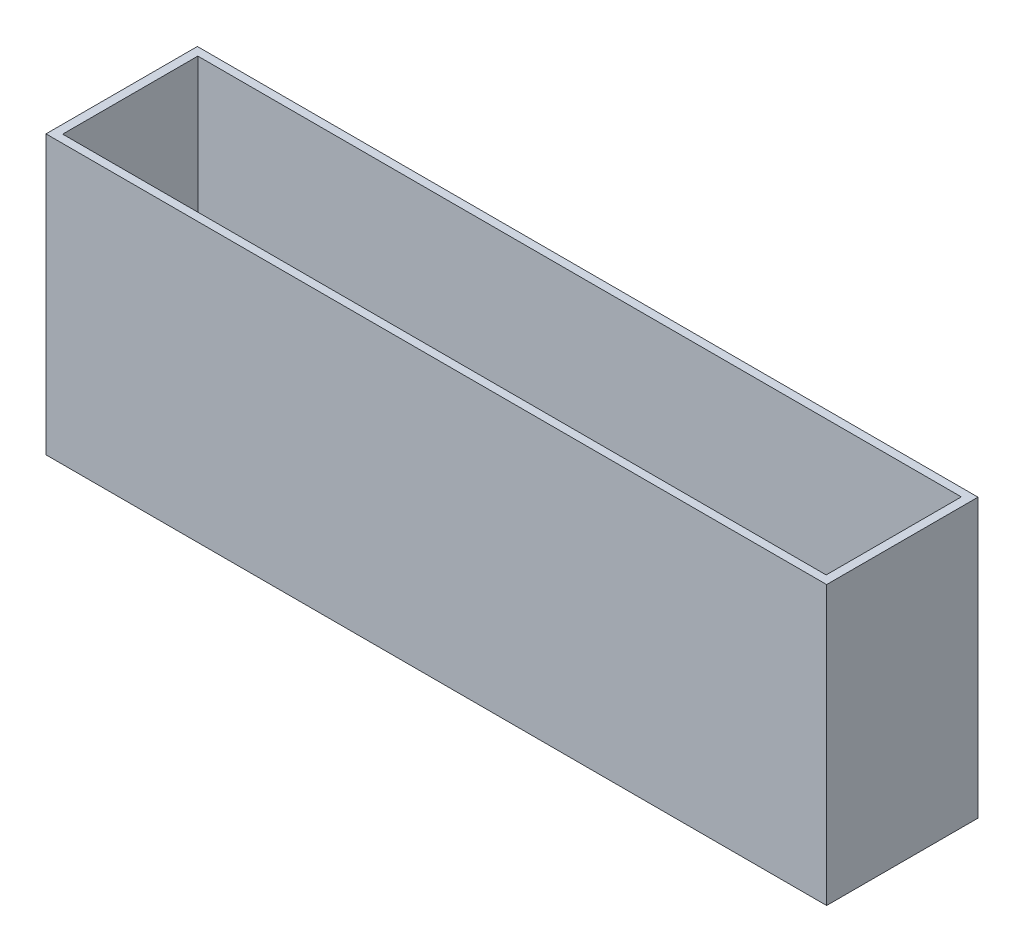
ISO-10303-21;
HEADER;
FILE_DESCRIPTION(('STEP AP214'),'2;1');
FILE_NAME('part.step','',(''),(''),'','','');
FILE_SCHEMA(('AUTOMOTIVE_DESIGN { 1 0 10303 214 1 1 1 1 }'));
ENDSEC;
DATA;
#1=APPLICATION_CONTEXT('core data for automotive mechanical design processes');
#2=APPLICATION_PROTOCOL_DEFINITION('international standard','automotive_design',2000,#1);
#3=PRODUCT_CONTEXT('',#1,'mechanical');
#4=PRODUCT('Part','Part','',(#3));
#5=PRODUCT_RELATED_PRODUCT_CATEGORY('part','',(#4));
#6=PRODUCT_DEFINITION_FORMATION('','',#4);
#7=PRODUCT_DEFINITION_CONTEXT('part definition',#1,'design');
#8=PRODUCT_DEFINITION('design','',#6,#7);
#9=PRODUCT_DEFINITION_SHAPE('','',#8);
#10=(LENGTH_UNIT() NAMED_UNIT(*) SI_UNIT(.MILLI.,.METRE.));
#11=(NAMED_UNIT(*) PLANE_ANGLE_UNIT() SI_UNIT($,.RADIAN.));
#12=(NAMED_UNIT(*) SI_UNIT($,.STERADIAN.) SOLID_ANGLE_UNIT());
#13=UNCERTAINTY_MEASURE_WITH_UNIT(LENGTH_MEASURE(1.E-05),#10,'distance_accuracy_value','');
#14=(GEOMETRIC_REPRESENTATION_CONTEXT(3) GLOBAL_UNCERTAINTY_ASSIGNED_CONTEXT((#13)) GLOBAL_UNIT_ASSIGNED_CONTEXT((#10,
#11,#12)) REPRESENTATION_CONTEXT('',''));
#15=CARTESIAN_POINT('',(0.,0.,0.));
#16=DIRECTION('',(0.,0.,1.));
#17=DIRECTION('',(1.,0.,0.));
#18=AXIS2_PLACEMENT_3D('',#15,#16,#17);
#19=CARTESIAN_POINT('',(-52.07,5.08,10.0965));
#20=DIRECTION('',(1.,0.,0.));
#21=DIRECTION('',(0.,0.,-1.));
#22=AXIS2_PLACEMENT_3D('',#19,#20,#21);
#23=PLANE('',#22);
#24=DIRECTION('',(0.,0.,1.));
#25=VECTOR('',#24,1.);
#26=CARTESIAN_POINT('',(-52.07,0.,10.0965));
#27=LINE('',#26,#25);
#28=CARTESIAN_POINT('',(-52.07,0.,-10.0965));
#29=VERTEX_POINT('',#28);
#30=CARTESIAN_POINT('',(-52.07,0.,10.0965));
#31=VERTEX_POINT('',#30);
#32=EDGE_CURVE('E271',#29,#31,#27,.T.);
#33=ORIENTED_EDGE('',*,*,#32,.T.);
#34=DIRECTION('',(0.,-1.,0.));
#35=VECTOR('',#34,1.);
#36=CARTESIAN_POINT('',(-52.07,5.08,10.0965));
#37=LINE('',#36,#35);
#38=CARTESIAN_POINT('',(-52.07,37.084,10.0965));
#39=VERTEX_POINT('',#38);
#40=EDGE_CURVE('E11',#39,#31,#37,.T.);
#41=ORIENTED_EDGE('',*,*,#40,.F.);
#42=DIRECTION('',(0.,0.,1.));
#43=VECTOR('',#42,1.);
#44=CARTESIAN_POINT('',(-52.07,37.084,0.));
#45=LINE('',#44,#43);
#46=CARTESIAN_POINT('',(-52.07,37.084,-10.0965));
#47=VERTEX_POINT('',#46);
#48=EDGE_CURVE('E230',#47,#39,#45,.T.);
#49=ORIENTED_EDGE('',*,*,#48,.F.);
#50=DIRECTION('',(0.,-1.,0.));
#51=VECTOR('',#50,1.);
#52=CARTESIAN_POINT('',(-52.07,5.08,-10.0965));
#53=LINE('',#52,#51);
#54=EDGE_CURVE('E280',#47,#29,#53,.T.);
#55=ORIENTED_EDGE('',*,*,#54,.T.);
#56=EDGE_LOOP('',(#33,#41,#49,#55));
#57=FACE_BOUND('',#56,.T.);
#58=ADVANCED_FACE('F38',(#57),#23,.F.);
#59=CARTESIAN_POINT('',(52.07,5.08,10.0965));
#60=DIRECTION('',(0.,0.,-1.));
#61=DIRECTION('',(-1.,0.,0.));
#62=AXIS2_PLACEMENT_3D('',#59,#60,#61);
#63=PLANE('',#62);
#64=DIRECTION('',(1.,0.,0.));
#65=VECTOR('',#64,1.);
#66=CARTESIAN_POINT('',(52.07,0.,10.0965));
#67=LINE('',#66,#65);
#68=CARTESIAN_POINT('',(52.07,0.,10.0965));
#69=VERTEX_POINT('',#68);
#70=EDGE_CURVE('E274',#31,#69,#67,.T.);
#71=ORIENTED_EDGE('',*,*,#70,.T.);
#72=DIRECTION('',(0.,-1.,0.));
#73=VECTOR('',#72,1.);
#74=CARTESIAN_POINT('',(52.07,5.08,10.0965));
#75=LINE('',#74,#73);
#76=CARTESIAN_POINT('',(52.07,37.084,10.0965));
#77=VERTEX_POINT('',#76);
#78=EDGE_CURVE('E45',#77,#69,#75,.T.);
#79=ORIENTED_EDGE('',*,*,#78,.F.);
#80=DIRECTION('',(1.,0.,0.));
#81=VECTOR('',#80,1.);
#82=CARTESIAN_POINT('',(0.,37.084,10.0965));
#83=LINE('',#82,#81);
#84=EDGE_CURVE('E234',#39,#77,#83,.T.);
#85=ORIENTED_EDGE('',*,*,#84,.F.);
#86=ORIENTED_EDGE('',*,*,#40,.T.);
#87=EDGE_LOOP('',(#71,#79,#85,#86));
#88=FACE_BOUND('',#87,.T.);
#89=ADVANCED_FACE('F304',(#88),#63,.F.);
#90=CARTESIAN_POINT('',(52.07,5.08,10.0965));
#91=DIRECTION('',(-1.,0.,0.));
#92=DIRECTION('',(0.,0.,1.));
#93=AXIS2_PLACEMENT_3D('',#90,#91,#92);
#94=PLANE('',#93);
#95=DIRECTION('',(0.,0.,-1.));
#96=VECTOR('',#95,1.);
#97=CARTESIAN_POINT('',(52.07,0.,10.0965));
#98=LINE('',#97,#96);
#99=CARTESIAN_POINT('',(52.07,0.,-10.0965));
#100=VERTEX_POINT('',#99);
#101=EDGE_CURVE('E276',#69,#100,#98,.T.);
#102=ORIENTED_EDGE('',*,*,#101,.T.);
#103=DIRECTION('',(0.,-1.,0.));
#104=VECTOR('',#103,1.);
#105=CARTESIAN_POINT('',(52.07,5.08,-10.0965));
#106=LINE('',#105,#104);
#107=CARTESIAN_POINT('',(52.07,37.084,-10.0965));
#108=VERTEX_POINT('',#107);
#109=EDGE_CURVE('E283',#108,#100,#106,.T.);
#110=ORIENTED_EDGE('',*,*,#109,.F.);
#111=DIRECTION('',(0.,0.,-1.));
#112=VECTOR('',#111,1.);
#113=CARTESIAN_POINT('',(52.07,37.084,0.));
#114=LINE('',#113,#112);
#115=EDGE_CURVE('E237',#77,#108,#114,.T.);
#116=ORIENTED_EDGE('',*,*,#115,.F.);
#117=ORIENTED_EDGE('',*,*,#78,.T.);
#118=EDGE_LOOP('',(#102,#110,#116,#117));
#119=FACE_BOUND('',#118,.T.);
#120=ADVANCED_FACE('F289',(#119),#94,.F.);
#121=CARTESIAN_POINT('',(52.07,5.08,-10.0965));
#122=DIRECTION('',(0.,0.,1.));
#123=DIRECTION('',(1.,0.,0.));
#124=AXIS2_PLACEMENT_3D('',#121,#122,#123);
#125=PLANE('',#124);
#126=DIRECTION('',(-1.,0.,0.));
#127=VECTOR('',#126,1.);
#128=CARTESIAN_POINT('',(52.07,0.,-10.0965));
#129=LINE('',#128,#127);
#130=EDGE_CURVE('E278',#100,#29,#129,.T.);
#131=ORIENTED_EDGE('',*,*,#130,.T.);
#132=ORIENTED_EDGE('',*,*,#54,.F.);
#133=DIRECTION('',(-1.,0.,0.));
#134=VECTOR('',#133,1.);
#135=CARTESIAN_POINT('',(0.,37.084,-10.0965));
#136=LINE('',#135,#134);
#137=EDGE_CURVE('E227',#108,#47,#136,.T.);
#138=ORIENTED_EDGE('',*,*,#137,.F.);
#139=ORIENTED_EDGE('',*,*,#109,.T.);
#140=EDGE_LOOP('',(#131,#132,#138,#139));
#141=FACE_BOUND('',#140,.T.);
#142=ADVANCED_FACE('F297',(#141),#125,.F.);
#143=CARTESIAN_POINT('',(0.,0.,0.));
#144=DIRECTION('',(0.,1.,0.));
#145=DIRECTION('',(0.,0.,1.));
#146=AXIS2_PLACEMENT_3D('',#143,#144,#145);
#147=PLANE('',#146);
#148=DIRECTION('',(1.,0.,0.));
#149=VECTOR('',#148,1.);
#150=CARTESIAN_POINT('',(0.,0.,8.76300000000001));
#151=LINE('',#150,#149);
#152=CARTESIAN_POINT('',(-38.227,0.,8.76300000000001));
#153=VERTEX_POINT('',#152);
#154=CARTESIAN_POINT('',(-5.20700000000001,0.,8.76300000000001));
#155=VERTEX_POINT('',#154);
#156=EDGE_CURVE('E220',#153,#155,#151,.T.);
#157=ORIENTED_EDGE('',*,*,#156,.T.);
#158=DIRECTION('',(0.,0.,-1.));
#159=VECTOR('',#158,1.);
#160=CARTESIAN_POINT('',(-5.20700000000001,0.,0.));
#161=LINE('',#160,#159);
#162=CARTESIAN_POINT('',(-5.20700000000001,0.,-8.76299999999999));
#163=VERTEX_POINT('',#162);
#164=EDGE_CURVE('E223',#155,#163,#161,.T.);
#165=ORIENTED_EDGE('',*,*,#164,.T.);
#166=DIRECTION('',(-1.,0.,0.));
#167=VECTOR('',#166,1.);
#168=CARTESIAN_POINT('',(0.,0.,-8.76299999999999));
#169=LINE('',#168,#167);
#170=CARTESIAN_POINT('',(-38.227,0.,-8.76299999999999));
#171=VERTEX_POINT('',#170);
#172=EDGE_CURVE('E217',#163,#171,#169,.T.);
#173=ORIENTED_EDGE('',*,*,#172,.T.);
#174=DIRECTION('',(0.,0.,1.));
#175=VECTOR('',#174,1.);
#176=CARTESIAN_POINT('',(-38.227,0.,0.));
#177=LINE('',#176,#175);
#178=EDGE_CURVE('E155',#171,#153,#177,.T.);
#179=ORIENTED_EDGE('',*,*,#178,.T.);
#180=EDGE_LOOP('',(#157,#165,#173,#179));
#181=FACE_BOUND('',#180,.T.);
#182=DIRECTION('',(1.,0.,0.));
#183=VECTOR('',#182,1.);
#184=CARTESIAN_POINT('',(0.,0.,8.763));
#185=LINE('',#184,#183);
#186=CARTESIAN_POINT('',(28.321,0.,8.763));
#187=VERTEX_POINT('',#186);
#188=CARTESIAN_POINT('',(45.847,0.,8.763));
#189=VERTEX_POINT('',#188);
#190=EDGE_CURVE('E211',#187,#189,#185,.T.);
#191=ORIENTED_EDGE('',*,*,#190,.T.);
#192=DIRECTION('',(0.,0.,-1.));
#193=VECTOR('',#192,1.);
#194=CARTESIAN_POINT('',(45.847,0.,0.));
#195=LINE('',#194,#193);
#196=CARTESIAN_POINT('',(45.847,0.,-8.763));
#197=VERTEX_POINT('',#196);
#198=EDGE_CURVE('E214',#189,#197,#195,.T.);
#199=ORIENTED_EDGE('',*,*,#198,.T.);
#200=DIRECTION('',(-1.,0.,0.));
#201=VECTOR('',#200,1.);
#202=CARTESIAN_POINT('',(0.,0.,-8.763));
#203=LINE('',#202,#201);
#204=CARTESIAN_POINT('',(28.321,0.,-8.763));
#205=VERTEX_POINT('',#204);
#206=EDGE_CURVE('E205',#197,#205,#203,.T.);
#207=ORIENTED_EDGE('',*,*,#206,.T.);
#208=DIRECTION('',(0.,0.,1.));
#209=VECTOR('',#208,1.);
#210=CARTESIAN_POINT('',(28.321,0.,0.));
#211=LINE('',#210,#209);
#212=EDGE_CURVE('E208',#205,#187,#211,.T.);
#213=ORIENTED_EDGE('',*,*,#212,.T.);
#214=EDGE_LOOP('',(#191,#199,#207,#213));
#215=FACE_BOUND('',#214,.T.);
#216=CARTESIAN_POINT('',(11.303,0.,0.));
#217=DIRECTION('',(0.,1.,0.));
#218=DIRECTION('',(0.,0.,1.));
#219=AXIS2_PLACEMENT_3D('',#216,#217,#218);
#220=CIRCLE('',#219,2.54);
#221=CARTESIAN_POINT('',(11.303,0.,2.54000000000001));
#222=VERTEX_POINT('',#221);
#223=EDGE_CURVE('E179',#222,#222,#220,.T.);
#224=ORIENTED_EDGE('',*,*,#223,.T.);
#225=EDGE_LOOP('',(#224));
#226=FACE_BOUND('',#225,.T.);
#227=ORIENTED_EDGE('',*,*,#32,.F.);
#228=ORIENTED_EDGE('',*,*,#130,.F.);
#229=ORIENTED_EDGE('',*,*,#101,.F.);
#230=ORIENTED_EDGE('',*,*,#70,.F.);
#231=EDGE_LOOP('',(#227,#228,#229,#230));
#232=FACE_BOUND('',#231,.T.);
#233=ADVANCED_FACE('F295',(#181,#215,#226,#232),#147,.F.);
#234=CARTESIAN_POINT('',(0.,37.084,9.017));
#235=DIRECTION('',(0.,0.,1.));
#236=DIRECTION('',(1.,0.,0.));
#237=AXIS2_PLACEMENT_3D('',#234,#235,#236);
#238=PLANE('',#237);
#239=DIRECTION('',(-1.,0.,0.));
#240=VECTOR('',#239,1.);
#241=CARTESIAN_POINT('',(0.,5.08,9.017));
#242=LINE('',#241,#240);
#243=CARTESIAN_POINT('',(50.927,5.08,9.01699999999999));
#244=VERTEX_POINT('',#243);
#245=CARTESIAN_POINT('',(-50.927,5.08,9.01700000000001));
#246=VERTEX_POINT('',#245);
#247=EDGE_CURVE('E226',#244,#246,#242,.T.);
#248=ORIENTED_EDGE('',*,*,#247,.T.);
#249=DIRECTION('',(0.,-1.,0.));
#250=VECTOR('',#249,1.);
#251=CARTESIAN_POINT('',(-50.927,37.084,9.01700000000001));
#252=LINE('',#251,#250);
#253=CARTESIAN_POINT('',(-50.927,37.084,9.01700000000001));
#254=VERTEX_POINT('',#253);
#255=EDGE_CURVE('E268',#254,#246,#252,.T.);
#256=ORIENTED_EDGE('',*,*,#255,.F.);
#257=DIRECTION('',(-1.,0.,0.));
#258=VECTOR('',#257,1.);
#259=CARTESIAN_POINT('',(0.,37.084,9.017));
#260=LINE('',#259,#258);
#261=CARTESIAN_POINT('',(50.927,37.084,9.01699999999999));
#262=VERTEX_POINT('',#261);
#263=EDGE_CURVE('E240',#262,#254,#260,.T.);
#264=ORIENTED_EDGE('',*,*,#263,.F.);
#265=DIRECTION('',(0.,-1.,0.));
#266=VECTOR('',#265,1.);
#267=CARTESIAN_POINT('',(50.927,37.084,9.01699999999999));
#268=LINE('',#267,#266);
#269=EDGE_CURVE('E251',#262,#244,#268,.T.);
#270=ORIENTED_EDGE('',*,*,#269,.T.);
#271=EDGE_LOOP('',(#248,#256,#264,#270));
#272=FACE_BOUND('',#271,.T.);
#273=ADVANCED_FACE('F316',(#272),#238,.F.);
#274=CARTESIAN_POINT('',(-50.927,37.084,0.));
#275=DIRECTION('',(-1.,0.,0.));
#276=DIRECTION('',(0.,0.,1.));
#277=AXIS2_PLACEMENT_3D('',#274,#275,#276);
#278=PLANE('',#277);
#279=DIRECTION('',(0.,0.,-1.));
#280=VECTOR('',#279,1.);
#281=CARTESIAN_POINT('',(-50.927,5.08,0.));
#282=LINE('',#281,#280);
#283=CARTESIAN_POINT('',(-50.927,5.08,-9.01699999999999));
#284=VERTEX_POINT('',#283);
#285=EDGE_CURVE('E254',#246,#284,#282,.T.);
#286=ORIENTED_EDGE('',*,*,#285,.T.);
#287=DIRECTION('',(0.,-1.,0.));
#288=VECTOR('',#287,1.);
#289=CARTESIAN_POINT('',(-50.927,37.084,-9.01699999999999));
#290=LINE('',#289,#288);
#291=CARTESIAN_POINT('',(-50.927,37.084,-9.01699999999999));
#292=VERTEX_POINT('',#291);
#293=EDGE_CURVE('E265',#292,#284,#290,.T.);
#294=ORIENTED_EDGE('',*,*,#293,.F.);
#295=DIRECTION('',(0.,0.,-1.));
#296=VECTOR('',#295,1.);
#297=CARTESIAN_POINT('',(-50.927,37.084,0.));
#298=LINE('',#297,#296);
#299=EDGE_CURVE('E243',#254,#292,#298,.T.);
#300=ORIENTED_EDGE('',*,*,#299,.F.);
#301=ORIENTED_EDGE('',*,*,#255,.T.);
#302=EDGE_LOOP('',(#286,#294,#300,#301));
#303=FACE_BOUND('',#302,.T.);
#304=ADVANCED_FACE('F323',(#303),#278,.F.);
#305=CARTESIAN_POINT('',(0.,37.084,-9.017));
#306=DIRECTION('',(0.,0.,1.));
#307=DIRECTION('',(1.,0.,0.));
#308=AXIS2_PLACEMENT_3D('',#305,#306,#307);
#309=PLANE('',#308);
#310=DIRECTION('',(-1.,0.,0.));
#311=VECTOR('',#310,1.);
#312=CARTESIAN_POINT('',(0.,5.08,-9.017));
#313=LINE('',#312,#311);
#314=CARTESIAN_POINT('',(50.927,5.08,-9.01700000000001));
#315=VERTEX_POINT('',#314);
#316=EDGE_CURVE('E257',#315,#284,#313,.T.);
#317=ORIENTED_EDGE('',*,*,#316,.F.);
#318=DIRECTION('',(0.,-1.,0.));
#319=VECTOR('',#318,1.);
#320=CARTESIAN_POINT('',(50.927,37.084,-9.01700000000001));
#321=LINE('',#320,#319);
#322=CARTESIAN_POINT('',(50.927,37.084,-9.01700000000001));
#323=VERTEX_POINT('',#322);
#324=EDGE_CURVE('E262',#323,#315,#321,.T.);
#325=ORIENTED_EDGE('',*,*,#324,.F.);
#326=DIRECTION('',(-1.,0.,0.));
#327=VECTOR('',#326,1.);
#328=CARTESIAN_POINT('',(0.,37.084,-9.017));
#329=LINE('',#328,#327);
#330=EDGE_CURVE('E245',#323,#292,#329,.T.);
#331=ORIENTED_EDGE('',*,*,#330,.T.);
#332=ORIENTED_EDGE('',*,*,#293,.T.);
#333=EDGE_LOOP('',(#317,#325,#331,#332));
#334=FACE_BOUND('',#333,.T.);
#335=ADVANCED_FACE('F327',(#334),#309,.T.);
#336=CARTESIAN_POINT('',(50.927,37.084,0.));
#337=DIRECTION('',(-1.,0.,0.));
#338=DIRECTION('',(0.,0.,1.));
#339=AXIS2_PLACEMENT_3D('',#336,#337,#338);
#340=PLANE('',#339);
#341=DIRECTION('',(0.,0.,-1.));
#342=VECTOR('',#341,1.);
#343=CARTESIAN_POINT('',(50.927,5.08,0.));
#344=LINE('',#343,#342);
#345=EDGE_CURVE('E231',#244,#315,#344,.T.);
#346=ORIENTED_EDGE('',*,*,#345,.F.);
#347=ORIENTED_EDGE('',*,*,#269,.F.);
#348=DIRECTION('',(0.,0.,-1.));
#349=VECTOR('',#348,1.);
#350=CARTESIAN_POINT('',(50.927,37.084,0.));
#351=LINE('',#350,#349);
#352=EDGE_CURVE('E248',#262,#323,#351,.T.);
#353=ORIENTED_EDGE('',*,*,#352,.T.);
#354=ORIENTED_EDGE('',*,*,#324,.T.);
#355=EDGE_LOOP('',(#346,#347,#353,#354));
#356=FACE_BOUND('',#355,.T.);
#357=ADVANCED_FACE('F331',(#356),#340,.T.);
#358=CARTESIAN_POINT('',(0.,37.084,0.));
#359=DIRECTION('',(0.,1.,0.));
#360=DIRECTION('',(0.,0.,1.));
#361=AXIS2_PLACEMENT_3D('',#358,#359,#360);
#362=PLANE('',#361);
#363=ORIENTED_EDGE('',*,*,#137,.T.);
#364=ORIENTED_EDGE('',*,*,#48,.T.);
#365=ORIENTED_EDGE('',*,*,#84,.T.);
#366=ORIENTED_EDGE('',*,*,#115,.T.);
#367=EDGE_LOOP('',(#363,#364,#365,#366));
#368=FACE_BOUND('',#367,.T.);
#369=ORIENTED_EDGE('',*,*,#263,.T.);
#370=ORIENTED_EDGE('',*,*,#299,.T.);
#371=ORIENTED_EDGE('',*,*,#330,.F.);
#372=ORIENTED_EDGE('',*,*,#352,.F.);
#373=EDGE_LOOP('',(#369,#370,#371,#372));
#374=FACE_BOUND('',#373,.T.);
#375=ADVANCED_FACE('F302',(#368,#374),#362,.T.);
#376=CARTESIAN_POINT('',(0.,5.08,0.));
#377=DIRECTION('',(0.,1.,0.));
#378=DIRECTION('',(0.,0.,1.));
#379=AXIS2_PLACEMENT_3D('',#376,#377,#378);
#380=PLANE('',#379);
#381=DIRECTION('',(0.,0.,-1.));
#382=VECTOR('',#381,1.);
#383=CARTESIAN_POINT('',(-5.20700000000001,5.08,8.76300000000001));
#384=LINE('',#383,#382);
#385=CARTESIAN_POINT('',(-5.20700000000001,5.08,8.76300000000001));
#386=VERTEX_POINT('',#385);
#387=CARTESIAN_POINT('',(-5.20700000000001,5.08,-8.76299999999999));
#388=VERTEX_POINT('',#387);
#389=EDGE_CURVE('E167',#386,#388,#384,.T.);
#390=ORIENTED_EDGE('',*,*,#389,.F.);
#391=DIRECTION('',(1.,0.,0.));
#392=VECTOR('',#391,1.);
#393=CARTESIAN_POINT('',(-38.227,5.08,8.76300000000001));
#394=LINE('',#393,#392);
#395=CARTESIAN_POINT('',(-38.227,5.08,8.76300000000001));
#396=VERTEX_POINT('',#395);
#397=EDGE_CURVE('E172',#396,#386,#394,.T.);
#398=ORIENTED_EDGE('',*,*,#397,.F.);
#399=DIRECTION('',(0.,0.,1.));
#400=VECTOR('',#399,1.);
#401=CARTESIAN_POINT('',(-38.227,5.08,8.76300000000001));
#402=LINE('',#401,#400);
#403=CARTESIAN_POINT('',(-38.227,5.08,-8.76299999999999));
#404=VERTEX_POINT('',#403);
#405=EDGE_CURVE('E152',#404,#396,#402,.T.);
#406=ORIENTED_EDGE('',*,*,#405,.F.);
#407=DIRECTION('',(-1.,0.,0.));
#408=VECTOR('',#407,1.);
#409=CARTESIAN_POINT('',(-38.227,5.08,-8.76299999999999));
#410=LINE('',#409,#408);
#411=EDGE_CURVE('E162',#388,#404,#410,.T.);
#412=ORIENTED_EDGE('',*,*,#411,.F.);
#413=EDGE_LOOP('',(#390,#398,#406,#412));
#414=FACE_BOUND('',#413,.T.);
#415=DIRECTION('',(0.,0.,-1.));
#416=VECTOR('',#415,1.);
#417=CARTESIAN_POINT('',(45.847,5.08,8.763));
#418=LINE('',#417,#416);
#419=CARTESIAN_POINT('',(45.847,5.08,8.763));
#420=VERTEX_POINT('',#419);
#421=CARTESIAN_POINT('',(45.847,5.08,-8.763));
#422=VERTEX_POINT('',#421);
#423=EDGE_CURVE('E182',#420,#422,#418,.T.);
#424=ORIENTED_EDGE('',*,*,#423,.F.);
#425=DIRECTION('',(1.,0.,0.));
#426=VECTOR('',#425,1.);
#427=CARTESIAN_POINT('',(28.321,5.08,8.763));
#428=LINE('',#427,#426);
#429=CARTESIAN_POINT('',(28.321,5.08,8.763));
#430=VERTEX_POINT('',#429);
#431=EDGE_CURVE('E190',#430,#420,#428,.T.);
#432=ORIENTED_EDGE('',*,*,#431,.F.);
#433=DIRECTION('',(0.,0.,1.));
#434=VECTOR('',#433,1.);
#435=CARTESIAN_POINT('',(28.321,5.08,8.763));
#436=LINE('',#435,#434);
#437=CARTESIAN_POINT('',(28.321,5.08,-8.763));
#438=VERTEX_POINT('',#437);
#439=EDGE_CURVE('E187',#438,#430,#436,.T.);
#440=ORIENTED_EDGE('',*,*,#439,.F.);
#441=DIRECTION('',(-1.,0.,0.));
#442=VECTOR('',#441,1.);
#443=CARTESIAN_POINT('',(28.321,5.08,-8.763));
#444=LINE('',#443,#442);
#445=EDGE_CURVE('E184',#422,#438,#444,.T.);
#446=ORIENTED_EDGE('',*,*,#445,.F.);
#447=EDGE_LOOP('',(#424,#432,#440,#446));
#448=FACE_BOUND('',#447,.T.);
#449=CARTESIAN_POINT('',(11.303,5.08,0.));
#450=DIRECTION('',(0.,1.,0.));
#451=DIRECTION('',(0.,0.,1.));
#452=AXIS2_PLACEMENT_3D('',#449,#450,#451);
#453=CIRCLE('',#452,2.54);
#454=CARTESIAN_POINT('',(11.303,5.08,2.54000000000001));
#455=VERTEX_POINT('',#454);
#456=EDGE_CURVE('E185',#455,#455,#453,.T.);
#457=ORIENTED_EDGE('',*,*,#456,.F.);
#458=EDGE_LOOP('',(#457));
#459=FACE_BOUND('',#458,.T.);
#460=ORIENTED_EDGE('',*,*,#285,.F.);
#461=ORIENTED_EDGE('',*,*,#247,.F.);
#462=ORIENTED_EDGE('',*,*,#345,.T.);
#463=ORIENTED_EDGE('',*,*,#316,.T.);
#464=EDGE_LOOP('',(#460,#461,#462,#463));
#465=FACE_BOUND('',#464,.T.);
#466=ADVANCED_FACE('F169',(#414,#448,#459,#465),#380,.T.);
#467=CARTESIAN_POINT('',(11.303,-26.924,0.));
#468=DIRECTION('',(0.,1.,0.));
#469=DIRECTION('',(0.,0.,1.));
#470=AXIS2_PLACEMENT_3D('',#467,#468,#469);
#471=CYLINDRICAL_SURFACE('',#470,2.54);
#472=ORIENTED_EDGE('',*,*,#456,.T.);
#473=EDGE_LOOP('',(#472));
#474=FACE_BOUND('',#473,.T.);
#475=ORIENTED_EDGE('',*,*,#223,.F.);
#476=EDGE_LOOP('',(#475));
#477=FACE_BOUND('',#476,.T.);
#478=ADVANCED_FACE('F320',(#474,#477),#471,.F.);
#479=CARTESIAN_POINT('',(45.847,-26.924,8.763));
#480=DIRECTION('',(1.,0.,0.));
#481=DIRECTION('',(0.,0.,-1.));
#482=AXIS2_PLACEMENT_3D('',#479,#480,#481);
#483=PLANE('',#482);
#484=DIRECTION('',(0.,1.,0.));
#485=VECTOR('',#484,1.);
#486=CARTESIAN_POINT('',(45.847,-26.924,8.763));
#487=LINE('',#486,#485);
#488=EDGE_CURVE('E194',#189,#420,#487,.T.);
#489=ORIENTED_EDGE('',*,*,#488,.T.);
#490=ORIENTED_EDGE('',*,*,#423,.T.);
#491=DIRECTION('',(0.,1.,0.));
#492=VECTOR('',#491,1.);
#493=CARTESIAN_POINT('',(45.847,-26.924,-8.763));
#494=LINE('',#493,#492);
#495=EDGE_CURVE('E193',#197,#422,#494,.T.);
#496=ORIENTED_EDGE('',*,*,#495,.F.);
#497=ORIENTED_EDGE('',*,*,#198,.F.);
#498=EDGE_LOOP('',(#489,#490,#496,#497));
#499=FACE_BOUND('',#498,.T.);
#500=ADVANCED_FACE('F340',(#499),#483,.F.);
#501=CARTESIAN_POINT('',(28.321,-26.924,8.763));
#502=DIRECTION('',(0.,0.,1.));
#503=DIRECTION('',(1.,0.,0.));
#504=AXIS2_PLACEMENT_3D('',#501,#502,#503);
#505=PLANE('',#504);
#506=DIRECTION('',(0.,1.,0.));
#507=VECTOR('',#506,1.);
#508=CARTESIAN_POINT('',(28.321,-26.924,8.763));
#509=LINE('',#508,#507);
#510=EDGE_CURVE('E196',#187,#430,#509,.T.);
#511=ORIENTED_EDGE('',*,*,#510,.T.);
#512=ORIENTED_EDGE('',*,*,#431,.T.);
#513=ORIENTED_EDGE('',*,*,#488,.F.);
#514=ORIENTED_EDGE('',*,*,#190,.F.);
#515=EDGE_LOOP('',(#511,#512,#513,#514));
#516=FACE_BOUND('',#515,.T.);
#517=ADVANCED_FACE('F344',(#516),#505,.F.);
#518=CARTESIAN_POINT('',(28.321,-26.924,8.763));
#519=DIRECTION('',(-1.,0.,0.));
#520=DIRECTION('',(0.,0.,1.));
#521=AXIS2_PLACEMENT_3D('',#518,#519,#520);
#522=PLANE('',#521);
#523=DIRECTION('',(0.,1.,0.));
#524=VECTOR('',#523,1.);
#525=CARTESIAN_POINT('',(28.321,-26.924,-8.763));
#526=LINE('',#525,#524);
#527=EDGE_CURVE('E60',#205,#438,#526,.T.);
#528=ORIENTED_EDGE('',*,*,#527,.T.);
#529=ORIENTED_EDGE('',*,*,#439,.T.);
#530=ORIENTED_EDGE('',*,*,#510,.F.);
#531=ORIENTED_EDGE('',*,*,#212,.F.);
#532=EDGE_LOOP('',(#528,#529,#530,#531));
#533=FACE_BOUND('',#532,.T.);
#534=ADVANCED_FACE('F350',(#533),#522,.F.);
#535=CARTESIAN_POINT('',(28.321,-26.924,-8.763));
#536=DIRECTION('',(0.,0.,-1.));
#537=DIRECTION('',(-1.,0.,0.));
#538=AXIS2_PLACEMENT_3D('',#535,#536,#537);
#539=PLANE('',#538);
#540=ORIENTED_EDGE('',*,*,#495,.T.);
#541=ORIENTED_EDGE('',*,*,#445,.T.);
#542=ORIENTED_EDGE('',*,*,#527,.F.);
#543=ORIENTED_EDGE('',*,*,#206,.F.);
#544=EDGE_LOOP('',(#540,#541,#542,#543));
#545=FACE_BOUND('',#544,.T.);
#546=ADVANCED_FACE('F346',(#545),#539,.F.);
#547=CARTESIAN_POINT('',(-5.20700000000001,-26.924,8.76300000000001));
#548=DIRECTION('',(1.,0.,0.));
#549=DIRECTION('',(0.,0.,-1.));
#550=AXIS2_PLACEMENT_3D('',#547,#548,#549);
#551=PLANE('',#550);
#552=DIRECTION('',(0.,1.,0.));
#553=VECTOR('',#552,1.);
#554=CARTESIAN_POINT('',(-5.20700000000001,-26.924,8.76300000000001));
#555=LINE('',#554,#553);
#556=EDGE_CURVE('E177',#155,#386,#555,.T.);
#557=ORIENTED_EDGE('',*,*,#556,.T.);
#558=ORIENTED_EDGE('',*,*,#389,.T.);
#559=DIRECTION('',(0.,1.,0.));
#560=VECTOR('',#559,1.);
#561=CARTESIAN_POINT('',(-5.20700000000001,-26.924,-8.76299999999999));
#562=LINE('',#561,#560);
#563=EDGE_CURVE('E158',#163,#388,#562,.T.);
#564=ORIENTED_EDGE('',*,*,#563,.F.);
#565=ORIENTED_EDGE('',*,*,#164,.F.);
#566=EDGE_LOOP('',(#557,#558,#564,#565));
#567=FACE_BOUND('',#566,.T.);
#568=ADVANCED_FACE('F349',(#567),#551,.F.);
#569=CARTESIAN_POINT('',(-38.227,-26.924,8.76300000000001));
#570=DIRECTION('',(0.,0.,1.));
#571=DIRECTION('',(1.,0.,0.));
#572=AXIS2_PLACEMENT_3D('',#569,#570,#571);
#573=PLANE('',#572);
#574=DIRECTION('',(0.,1.,0.));
#575=VECTOR('',#574,1.);
#576=CARTESIAN_POINT('',(-38.227,-26.924,8.76300000000001));
#577=LINE('',#576,#575);
#578=EDGE_CURVE('E157',#153,#396,#577,.T.);
#579=ORIENTED_EDGE('',*,*,#578,.T.);
#580=ORIENTED_EDGE('',*,*,#397,.T.);
#581=ORIENTED_EDGE('',*,*,#556,.F.);
#582=ORIENTED_EDGE('',*,*,#156,.F.);
#583=EDGE_LOOP('',(#579,#580,#581,#582));
#584=FACE_BOUND('',#583,.T.);
#585=ADVANCED_FACE('F359',(#584),#573,.F.);
#586=CARTESIAN_POINT('',(-38.227,-26.924,8.76300000000001));
#587=DIRECTION('',(-1.,0.,0.));
#588=DIRECTION('',(0.,0.,1.));
#589=AXIS2_PLACEMENT_3D('',#586,#587,#588);
#590=PLANE('',#589);
#591=DIRECTION('',(0.,1.,0.));
#592=VECTOR('',#591,1.);
#593=CARTESIAN_POINT('',(-38.227,-26.924,-8.76299999999999));
#594=LINE('',#593,#592);
#595=EDGE_CURVE('E52',#171,#404,#594,.T.);
#596=ORIENTED_EDGE('',*,*,#595,.T.);
#597=ORIENTED_EDGE('',*,*,#405,.T.);
#598=ORIENTED_EDGE('',*,*,#578,.F.);
#599=ORIENTED_EDGE('',*,*,#178,.F.);
#600=EDGE_LOOP('',(#596,#597,#598,#599));
#601=FACE_BOUND('',#600,.T.);
#602=ADVANCED_FACE('F149',(#601),#590,.F.);
#603=CARTESIAN_POINT('',(-38.227,-26.924,-8.76299999999999));
#604=DIRECTION('',(0.,0.,-1.));
#605=DIRECTION('',(-1.,0.,0.));
#606=AXIS2_PLACEMENT_3D('',#603,#604,#605);
#607=PLANE('',#606);
#608=ORIENTED_EDGE('',*,*,#563,.T.);
#609=ORIENTED_EDGE('',*,*,#411,.T.);
#610=ORIENTED_EDGE('',*,*,#595,.F.);
#611=ORIENTED_EDGE('',*,*,#172,.F.);
#612=EDGE_LOOP('',(#608,#609,#610,#611));
#613=FACE_BOUND('',#612,.T.);
#614=ADVANCED_FACE('F163',(#613),#607,.F.);
#615=CLOSED_SHELL('',(#58,#89,#120,#142,#233,#273,#304,#335,#357,#375,#466,#478,#500,#517,#534,
#546,#568,#585,#602,#614));
#616=MANIFOLD_SOLID_BREP('B2',#615);
#617=ADVANCED_BREP_SHAPE_REPRESENTATION('',(#18,#616),#14);
#618=SHAPE_DEFINITION_REPRESENTATION(#9,#617);
ENDSEC;
END-ISO-10303-21;
